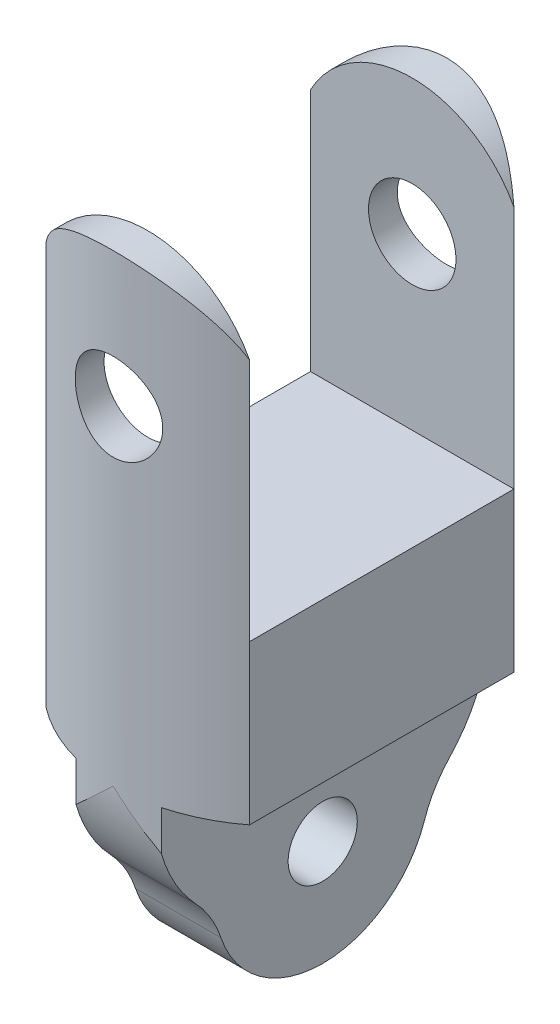
ISO-10303-21;
HEADER;
FILE_DESCRIPTION(('STEP AP214'),'2;1');
FILE_NAME('part.step','',(''),(''),'','','');
FILE_SCHEMA(('AUTOMOTIVE_DESIGN { 1 0 10303 214 1 1 1 1 }'));
ENDSEC;
DATA;
#1=APPLICATION_CONTEXT('core data for automotive mechanical design processes');
#2=APPLICATION_PROTOCOL_DEFINITION('international standard','automotive_design',2000,#1);
#3=PRODUCT_CONTEXT('',#1,'mechanical');
#4=PRODUCT('Part','Part','',(#3));
#5=PRODUCT_RELATED_PRODUCT_CATEGORY('part','',(#4));
#6=PRODUCT_DEFINITION_FORMATION('','',#4);
#7=PRODUCT_DEFINITION_CONTEXT('part definition',#1,'design');
#8=PRODUCT_DEFINITION('design','',#6,#7);
#9=PRODUCT_DEFINITION_SHAPE('','',#8);
#10=(LENGTH_UNIT() NAMED_UNIT(*) SI_UNIT(.MILLI.,.METRE.));
#11=(NAMED_UNIT(*) PLANE_ANGLE_UNIT() SI_UNIT($,.RADIAN.));
#12=(NAMED_UNIT(*) SI_UNIT($,.STERADIAN.) SOLID_ANGLE_UNIT());
#13=UNCERTAINTY_MEASURE_WITH_UNIT(LENGTH_MEASURE(1.E-05),#10,'distance_accuracy_value','');
#14=(GEOMETRIC_REPRESENTATION_CONTEXT(3) GLOBAL_UNCERTAINTY_ASSIGNED_CONTEXT((#13)) GLOBAL_UNIT_ASSIGNED_CONTEXT((#10,
#11,#12)) REPRESENTATION_CONTEXT('',''));
#15=CARTESIAN_POINT('',(0.,0.,0.));
#16=DIRECTION('',(0.,0.,1.));
#17=DIRECTION('',(1.,0.,0.));
#18=AXIS2_PLACEMENT_3D('',#15,#16,#17);
#19=CARTESIAN_POINT('',(1.05,0.,-0.499999999999999));
#20=DIRECTION('',(-1.,0.,0.));
#21=DIRECTION('',(0.,0.,1.));
#22=AXIS2_PLACEMENT_3D('',#19,#20,#21);
#23=CYLINDRICAL_SURFACE('',#22,3.6);
#24=CARTESIAN_POINT('',(1.05,-0.982735393101146,-3.96326885285366));
#25=CARTESIAN_POINT('',(0.964043175641878,-0.902481091641217,-3.98603422124339));
#26=CARTESIAN_POINT('',(0.877743048242477,-0.821831456548573,-4.00591264577449));
#27=CARTESIAN_POINT('',(0.704582146062499,-0.659897508889304,-4.03997120784259));
#28=CARTESIAN_POINT('',(0.617721265402065,-0.578613075815934,-4.05415023524226));
#29=CARTESIAN_POINT('',(0.357375549309111,-0.334873916517844,-4.08813062306567));
#30=CARTESIAN_POINT('',(0.18329676022133,-0.171756829119035,-4.09959296728294));
#31=CARTESIAN_POINT('',(0.00622980268695264,-0.00583759021220857,-4.09999644868644));
#32=CARTESIAN_POINT('',(0.00311487836894643,-0.00291877351620507,-4.09999999830493));
#33=CARTESIAN_POINT('',(0.,0.,-4.1));
#34=B_SPLINE_CURVE_WITH_KNOTS('',3,(#24,#25,#26,#27,#28,#29,#30,#31,#32,#33),.UNSPECIFIED.,.F.,
.F.,(4,2,2,2,4),(0.,0.359236470320328,0.718542879404652,1.43369480765825,1.44650106056099),.UNSPECIFIED.);
#35=CARTESIAN_POINT('',(1.05,-0.982735393101146,-3.96326885285366));
#36=VERTEX_POINT('',#35);
#37=CARTESIAN_POINT('',(0.,0.,-4.1));
#38=VERTEX_POINT('',#37);
#39=EDGE_CURVE('E148',#36,#38,#34,.T.);
#40=ORIENTED_EDGE('',*,*,#39,.F.);
#41=CARTESIAN_POINT('',(1.05,0.,-0.499999999999999));
#42=DIRECTION('',(1.,0.,0.));
#43=DIRECTION('',(0.,0.,-1.));
#44=AXIS2_PLACEMENT_3D('',#41,#42,#43);
#45=CIRCLE('',#44,3.6);
#46=CARTESIAN_POINT('',(1.05,-2.46949591686409,-3.11946366964529));
#47=VERTEX_POINT('',#46);
#48=EDGE_CURVE('E172',#47,#36,#45,.T.);
#49=ORIENTED_EDGE('',*,*,#48,.F.);
#50=DIRECTION('',(-1.,0.,0.));
#51=VECTOR('',#50,1.);
#52=CARTESIAN_POINT('',(1.05,-2.46949591686409,-3.11946366964529));
#53=LINE('',#52,#51);
#54=CARTESIAN_POINT('',(-1.05,-2.46949591686409,-3.11946366964529));
#55=VERTEX_POINT('',#54);
#56=EDGE_CURVE('E238',#47,#55,#53,.T.);
#57=ORIENTED_EDGE('',*,*,#56,.T.);
#58=CARTESIAN_POINT('',(-1.05,0.,-0.499999999999999));
#59=DIRECTION('',(1.,0.,0.));
#60=DIRECTION('',(0.,0.,-1.));
#61=AXIS2_PLACEMENT_3D('',#58,#59,#60);
#62=CIRCLE('',#61,3.6);
#63=CARTESIAN_POINT('',(-1.05,-0.982735393101146,-3.96326885285366));
#64=VERTEX_POINT('',#63);
#65=EDGE_CURVE('E153',#55,#64,#62,.T.);
#66=ORIENTED_EDGE('',*,*,#65,.T.);
#67=CARTESIAN_POINT('',(-1.05,-0.982735393101146,-3.96326885285366));
#68=CARTESIAN_POINT('',(-0.964043175641878,-0.902481091641217,-3.98603422124339));
#69=CARTESIAN_POINT('',(-0.877743048242477,-0.821831456548573,-4.00591264577449));
#70=CARTESIAN_POINT('',(-0.704582146062499,-0.659897508889304,-4.03997120784259));
#71=CARTESIAN_POINT('',(-0.617721265402065,-0.578613075815934,-4.05415023524226));
#72=CARTESIAN_POINT('',(-0.357375549309111,-0.334873916517844,-4.08813062306567));
#73=CARTESIAN_POINT('',(-0.18329676022133,-0.171756829119035,-4.09959296728294));
#74=CARTESIAN_POINT('',(-0.00622980268695264,-0.00583759021220857,-4.09999644868644));
#75=CARTESIAN_POINT('',(-0.00311487836894643,-0.00291877351620507,-4.09999999830493));
#76=CARTESIAN_POINT('',(0.,0.,-4.1));
#77=B_SPLINE_CURVE_WITH_KNOTS('',3,(#67,#68,#69,#70,#71,#72,#73,#74,#75,#76),.UNSPECIFIED.,.F.,
.F.,(4,2,2,2,4),(0.,0.359236470320328,0.718542879404652,1.43369480765825,1.44650106056099),.UNSPECIFIED.);
#78=EDGE_CURVE('E59',#64,#38,#77,.T.);
#79=ORIENTED_EDGE('',*,*,#78,.T.);
#80=EDGE_LOOP('',(#40,#49,#57,#66,#79));
#81=FACE_BOUND('',#80,.T.);
#82=ADVANCED_FACE('F36',(#81),#23,.T.);
#83=CARTESIAN_POINT('',(1.05,0.,0.499999999999999));
#84=DIRECTION('',(-1.,0.,0.));
#85=DIRECTION('',(0.,0.,1.));
#86=AXIS2_PLACEMENT_3D('',#83,#84,#85);
#87=CYLINDRICAL_SURFACE('',#86,3.6);
#88=CARTESIAN_POINT('',(1.05,-0.982735393101146,3.96326885285366));
#89=CARTESIAN_POINT('',(0.964043175641878,-0.902481091641217,3.98603422124339));
#90=CARTESIAN_POINT('',(0.877743048242477,-0.821831456548573,4.00591264577449));
#91=CARTESIAN_POINT('',(0.704582146062499,-0.659897508889304,4.03997120784259));
#92=CARTESIAN_POINT('',(0.617721265402065,-0.578613075815934,4.05415023524226));
#93=CARTESIAN_POINT('',(0.357375549309111,-0.334873916517844,4.08813062306567));
#94=CARTESIAN_POINT('',(0.18329676022133,-0.171756829119035,4.09959296728294));
#95=CARTESIAN_POINT('',(0.00622980268695264,-0.00583759021220857,4.09999644868644));
#96=CARTESIAN_POINT('',(0.00311487836894643,-0.00291877351620507,4.09999999830493));
#97=CARTESIAN_POINT('',(0.,0.,4.1));
#98=B_SPLINE_CURVE_WITH_KNOTS('',3,(#88,#89,#90,#91,#92,#93,#94,#95,#96,#97),.UNSPECIFIED.,.F.,
.F.,(4,2,2,2,4),(0.,0.359236470320328,0.718542879404652,1.43369480765825,1.44650106056099),.UNSPECIFIED.);
#99=CARTESIAN_POINT('',(0.,0.,4.1));
#100=VERTEX_POINT('',#99);
#101=CARTESIAN_POINT('',(1.05,-0.982735393101146,3.96326885285366));
#102=VERTEX_POINT('',#101);
#103=EDGE_CURVE('E52',#100,#102,#98,.F.);
#104=ORIENTED_EDGE('',*,*,#103,.F.);
#105=CARTESIAN_POINT('',(-1.05,-0.982735393101146,3.96326885285366));
#106=CARTESIAN_POINT('',(-0.964043175641878,-0.902481091641217,3.98603422124339));
#107=CARTESIAN_POINT('',(-0.877743048242477,-0.821831456548573,4.00591264577449));
#108=CARTESIAN_POINT('',(-0.704582146062499,-0.659897508889304,4.03997120784259));
#109=CARTESIAN_POINT('',(-0.617721265402065,-0.578613075815934,4.05415023524226));
#110=CARTESIAN_POINT('',(-0.357375549309111,-0.334873916517844,4.08813062306567));
#111=CARTESIAN_POINT('',(-0.18329676022133,-0.171756829119035,4.09959296728294));
#112=CARTESIAN_POINT('',(-0.00622980268695264,-0.00583759021220857,4.09999644868644));
#113=CARTESIAN_POINT('',(-0.00311487836894643,-0.00291877351620507,4.09999999830493));
#114=CARTESIAN_POINT('',(0.,0.,4.1));
#115=B_SPLINE_CURVE_WITH_KNOTS('',3,(#105,#106,#107,#108,#109,#110,#111,#112,#113,#114),
.UNSPECIFIED.,.F.,.F.,(4,2,2,2,4),(0.,0.359236470320328,0.718542879404652,1.43369480765825,
1.44650106056099),.UNSPECIFIED.);
#116=CARTESIAN_POINT('',(-1.05,-0.982735393101146,3.96326885285366));
#117=VERTEX_POINT('',#116);
#118=EDGE_CURVE('E144',#100,#117,#115,.F.);
#119=ORIENTED_EDGE('',*,*,#118,.T.);
#120=CARTESIAN_POINT('',(-1.05,0.,0.499999999999999));
#121=DIRECTION('',(1.,0.,0.));
#122=DIRECTION('',(0.,0.,1.));
#123=AXIS2_PLACEMENT_3D('',#120,#121,#122);
#124=CIRCLE('',#123,3.6);
#125=CARTESIAN_POINT('',(-1.05,-2.46949591686409,3.11946366964529));
#126=VERTEX_POINT('',#125);
#127=EDGE_CURVE('E156',#117,#126,#124,.T.);
#128=ORIENTED_EDGE('',*,*,#127,.T.);
#129=DIRECTION('',(-1.,0.,0.));
#130=VECTOR('',#129,1.);
#131=CARTESIAN_POINT('',(1.05,-2.46949591686409,3.11946366964529));
#132=LINE('',#131,#130);
#133=CARTESIAN_POINT('',(1.05,-2.46949591686409,3.11946366964529));
#134=VERTEX_POINT('',#133);
#135=EDGE_CURVE('E245',#134,#126,#132,.T.);
#136=ORIENTED_EDGE('',*,*,#135,.F.);
#137=CARTESIAN_POINT('',(1.05,0.,0.499999999999999));
#138=DIRECTION('',(1.,0.,0.));
#139=DIRECTION('',(0.,0.,1.));
#140=AXIS2_PLACEMENT_3D('',#137,#138,#139);
#141=CIRCLE('',#140,3.6);
#142=EDGE_CURVE('E147',#102,#134,#141,.T.);
#143=ORIENTED_EDGE('',*,*,#142,.F.);
#144=EDGE_LOOP('',(#104,#119,#128,#136,#143));
#145=FACE_BOUND('',#144,.T.);
#146=ADVANCED_FACE('F143',(#145),#87,.T.);
#147=CARTESIAN_POINT('',(1.05,0.,-0.499999999999999));
#148=DIRECTION('',(1.,0.,0.));
#149=DIRECTION('',(0.,0.,-1.));
#150=AXIS2_PLACEMENT_3D('',#147,#148,#149);
#151=PLANE('',#150);
#152=CARTESIAN_POINT('',(1.05,-2.7,0.));
#153=DIRECTION('',(1.,0.,0.));
#154=DIRECTION('',(0.,0.,-1.));
#155=AXIS2_PLACEMENT_3D('',#152,#153,#154);
#156=CIRCLE('',#155,0.85);
#157=CARTESIAN_POINT('',(1.05,-2.7,-0.850000000000001));
#158=VERTEX_POINT('',#157);
#159=EDGE_CURVE('E577',#158,#158,#156,.T.);
#160=ORIENTED_EDGE('',*,*,#159,.F.);
#161=EDGE_LOOP('',(#160));
#162=FACE_BOUND('',#161,.T.);
#163=DIRECTION('',(0.,0.,1.));
#164=VECTOR('',#163,1.);
#165=CARTESIAN_POINT('',(1.05,0.,-4.1));
#166=LINE('',#165,#164);
#167=CARTESIAN_POINT('',(1.05,0.,-3.96326885285366));
#168=VERTEX_POINT('',#167);
#169=CARTESIAN_POINT('',(1.05,0.,3.96326885285366));
#170=VERTEX_POINT('',#169);
#171=EDGE_CURVE('E348',#168,#170,#166,.T.);
#172=ORIENTED_EDGE('',*,*,#171,.T.);
#173=DIRECTION('',(0.,1.,0.));
#174=VECTOR('',#173,1.);
#175=CARTESIAN_POINT('',(1.05,-5.3,3.96326885285366));
#176=LINE('',#175,#174);
#177=EDGE_CURVE('E11',#170,#102,#176,.F.);
#178=ORIENTED_EDGE('',*,*,#177,.T.);
#179=ORIENTED_EDGE('',*,*,#142,.T.);
#180=CARTESIAN_POINT('',(1.05,-4.39021496331394,5.15682430159163));
#181=DIRECTION('',(-1.,0.,0.));
#182=DIRECTION('',(0.,0.,-1.));
#183=AXIS2_PLACEMENT_3D('',#180,#181,#182);
#184=CIRCLE('',#183,2.8);
#185=CARTESIAN_POINT('',(1.05,-3.5,2.50210824914987));
#186=VERTEX_POINT('',#185);
#187=EDGE_CURVE('E227',#134,#186,#184,.T.);
#188=ORIENTED_EDGE('',*,*,#187,.T.);
#189=CARTESIAN_POINT('',(1.05,-2.66095953042672,0.));
#190=DIRECTION('',(1.,0.,0.));
#191=DIRECTION('',(0.,0.,1.));
#192=AXIS2_PLACEMENT_3D('',#189,#190,#191);
#193=CIRCLE('',#192,2.63904046957328);
#194=CARTESIAN_POINT('',(1.05,-3.5,-2.50210824914987));
#195=VERTEX_POINT('',#194);
#196=EDGE_CURVE('E374',#186,#195,#193,.T.);
#197=ORIENTED_EDGE('',*,*,#196,.T.);
#198=CARTESIAN_POINT('',(1.05,-4.39021496331394,-5.15682430159163));
#199=DIRECTION('',(-1.,0.,0.));
#200=DIRECTION('',(0.,0.,1.));
#201=AXIS2_PLACEMENT_3D('',#198,#199,#200);
#202=CIRCLE('',#201,2.8);
#203=EDGE_CURVE('E224',#195,#47,#202,.T.);
#204=ORIENTED_EDGE('',*,*,#203,.T.);
#205=ORIENTED_EDGE('',*,*,#48,.T.);
#206=DIRECTION('',(0.,1.,0.));
#207=VECTOR('',#206,1.);
#208=CARTESIAN_POINT('',(1.05,-5.3,-3.96326885285366));
#209=LINE('',#208,#207);
#210=EDGE_CURVE('E45',#36,#168,#209,.T.);
#211=ORIENTED_EDGE('',*,*,#210,.T.);
#212=EDGE_LOOP('',(#172,#178,#179,#188,#197,#204,#205,#211));
#213=FACE_BOUND('',#212,.T.);
#214=ADVANCED_FACE('F179',(#162,#213),#151,.T.);
#215=CARTESIAN_POINT('',(0.,0.,0.));
#216=DIRECTION('',(0.,1.,0.));
#217=DIRECTION('',(0.,0.,1.));
#218=AXIS2_PLACEMENT_3D('',#215,#216,#217);
#219=PLANE('',#218);
#220=ORIENTED_EDGE('',*,*,#171,.F.);
#221=CARTESIAN_POINT('',(0.,0.,0.));
#222=DIRECTION('',(0.,1.,0.));
#223=DIRECTION('',(0.,0.,1.));
#224=AXIS2_PLACEMENT_3D('',#221,#222,#223);
#225=CIRCLE('',#224,4.1);
#226=CARTESIAN_POINT('',(2.5,0.,-3.24961536185438));
#227=VERTEX_POINT('',#226);
#228=EDGE_CURVE('E334',#227,#168,#225,.T.);
#229=ORIENTED_EDGE('',*,*,#228,.F.);
#230=DIRECTION('',(0.,0.,1.));
#231=VECTOR('',#230,1.);
#232=CARTESIAN_POINT('',(2.5,0.,-3.24961536185438));
#233=LINE('',#232,#231);
#234=CARTESIAN_POINT('',(2.5,0.,3.24961536185438));
#235=VERTEX_POINT('',#234);
#236=EDGE_CURVE('E321',#227,#235,#233,.T.);
#237=ORIENTED_EDGE('',*,*,#236,.T.);
#238=EDGE_CURVE('E318',#170,#235,#225,.T.);
#239=ORIENTED_EDGE('',*,*,#238,.F.);
#240=EDGE_LOOP('',(#220,#229,#237,#239));
#241=FACE_BOUND('',#240,.T.);
#242=ADVANCED_FACE('F387',(#241),#219,.F.);
#243=CARTESIAN_POINT('',(0.,3.9,0.));
#244=DIRECTION('',(0.,-1.,0.));
#245=DIRECTION('',(0.,0.,-1.));
#246=AXIS2_PLACEMENT_3D('',#243,#244,#245);
#247=CYLINDRICAL_SURFACE('',#246,4.1);
#248=CARTESIAN_POINT('',(1.075,8.075,3.95656100673299));
#249=CARTESIAN_POINT('',(1.07499849759736,8.01574132662267,3.95656206740196));
#250=CARTESIAN_POINT('',(1.07008341377569,7.9564665605543,3.95790686017436));
#251=CARTESIAN_POINT('',(1.05058857711479,7.83962623334418,3.96312528869724));
#252=CARTESIAN_POINT('',(1.0360037644684,7.78206158352731,3.96700024837327));
#253=CARTESIAN_POINT('',(0.997679687998758,7.67034855045897,3.97681065220181));
#254=CARTESIAN_POINT('',(0.973953005652445,7.61619559053382,3.98274326340092));
#255=CARTESIAN_POINT('',(0.918057826828671,7.51263105984774,3.99599692599379));
#256=CARTESIAN_POINT('',(0.885888755045638,7.46321981252372,4.00331807199965));
#257=CARTESIAN_POINT('',(0.813190218566315,7.36934621413438,4.01872226266153));
#258=CARTESIAN_POINT('',(0.772493510240412,7.32501551218003,4.02681845490151));
#259=CARTESIAN_POINT('',(0.68425476628872,7.24372408582354,4.04274686541313));
#260=CARTESIAN_POINT('',(0.636712041411825,7.20676410439388,4.05057905700731));
#261=CARTESIAN_POINT('',(0.535220965322456,7.14071714264202,4.06524336070602));
#262=CARTESIAN_POINT('',(0.481184998356998,7.11176061786676,4.07205815267456));
#263=CARTESIAN_POINT('',(0.368803395967924,7.06339262097833,4.08376919542231));
#264=CARTESIAN_POINT('',(0.310458463981335,7.04397959483679,4.08866575853249));
#265=CARTESIAN_POINT('',(0.192488821876719,7.0156745293719,4.09589567340773));
#266=CARTESIAN_POINT('',(0.132921214497386,7.00655864905926,4.0982834770156));
#267=CARTESIAN_POINT('',(0.0130575266366287,6.99840284137139,4.10041704245248));
#268=CARTESIAN_POINT('',(-0.0472384342389824,6.99936128152852,4.10016323233513));
#269=CARTESIAN_POINT('',(-0.165290750598638,7.01116835633689,4.09708223923197));
#270=CARTESIAN_POINT('',(-0.223073179232972,7.02177521284475,4.09431796819109));
#271=CARTESIAN_POINT('',(-0.336007436455476,7.05218797022689,4.08660061506));
#272=CARTESIAN_POINT('',(-0.391159117426172,7.07199438664224,4.08164741030325));
#273=CARTESIAN_POINT('',(-0.497888950041009,7.12043214985336,4.07001462008528));
#274=CARTESIAN_POINT('',(-0.549427262375742,7.14914721098965,4.06331875939417));
#275=CARTESIAN_POINT('',(-0.647036803273639,7.21452310495379,4.04892345478641));
#276=CARTESIAN_POINT('',(-0.69310699455549,7.25118544163276,4.04122382103734));
#277=CARTESIAN_POINT('',(-0.779915378155389,7.3327021445523,4.02538680070955));
#278=CARTESIAN_POINT('',(-0.820454532592611,7.3777675039994,4.01724320473778));
#279=CARTESIAN_POINT('',(-0.89344741282204,7.47414154328828,4.0016432592795));
#280=CARTESIAN_POINT('',(-0.925900678865949,7.52545057788685,3.99418694888594));
#281=CARTESIAN_POINT('',(-0.981945388091943,7.63327574893972,3.98078160641959));
#282=CARTESIAN_POINT('',(-1.00548443968057,7.68982031126482,3.97484155036279));
#283=CARTESIAN_POINT('',(-1.04265792509342,7.80625855083137,3.9652537175281));
#284=CARTESIAN_POINT('',(-1.05629472163037,7.86615142547817,3.96160539396286));
#285=CARTESIAN_POINT('',(-1.07293702135626,7.98572896752369,3.95713012463314));
#286=CARTESIAN_POINT('',(-1.07623871357283,8.04536951842825,3.95622459952246));
#287=CARTESIAN_POINT('',(-1.07293171991393,8.16435022682968,3.95712276213092));
#288=CARTESIAN_POINT('',(-1.06632404911008,8.22369041446972,3.95892617235865));
#289=CARTESIAN_POINT('',(-1.04364663303936,8.33925615395164,3.96496326936691));
#290=CARTESIAN_POINT('',(-1.02775339250444,8.39551894073246,3.96915158592993));
#291=CARTESIAN_POINT('',(-0.987153686556943,8.50458069467325,3.97944259583222));
#292=CARTESIAN_POINT('',(-0.962446098844254,8.55737921972686,3.98554553294151));
#293=CARTESIAN_POINT('',(-0.904312656440511,8.65925721876358,3.99914056013659));
#294=CARTESIAN_POINT('',(-0.87071200611369,8.70823328433531,4.00665951542921));
#295=CARTESIAN_POINT('',(-0.79596409344592,8.7999606560087,4.02217544231572));
#296=CARTESIAN_POINT('',(-0.754815461445512,8.84271082982798,4.03017250048851));
#297=CARTESIAN_POINT('',(-0.664772555293326,8.9219942573166,4.0460129363827));
#298=CARTESIAN_POINT('',(-0.615694607454198,8.95832141136516,4.05384584531087));
#299=CARTESIAN_POINT('',(-0.511964720549799,9.02222070507396,4.06824652310823));
#300=CARTESIAN_POINT('',(-0.457313077652485,9.04979330960247,4.07481435914575));
#301=CARTESIAN_POINT('',(-0.344370986261521,9.09515102214198,4.08590269845685));
#302=CARTESIAN_POINT('',(-0.286111206476481,9.11300862287461,4.0904383198074));
#303=CARTESIAN_POINT('',(-0.167281547788191,9.13864192161308,4.0970176350422));
#304=CARTESIAN_POINT('',(-0.10671216540344,9.14641977412459,4.09906186144654));
#305=CARTESIAN_POINT('',(0.0130889998748183,9.15154156404195,4.10040384380439));
#306=CARTESIAN_POINT('',(0.0723071305459086,9.14918831288753,4.09978131012199));
#307=CARTESIAN_POINT('',(0.189473449554427,9.13481518474304,4.09603902270504));
#308=CARTESIAN_POINT('',(0.247421682699277,9.12279564938683,4.09291935722621));
#309=CARTESIAN_POINT('',(0.360051931358176,9.08960003028369,4.08454821532234));
#310=CARTESIAN_POINT('',(0.414752619289789,9.06848356586698,4.07931063275472));
#311=CARTESIAN_POINT('',(0.519865777088888,9.01774690943509,4.06725235139821));
#312=CARTESIAN_POINT('',(0.570277660162292,8.98812555619921,4.06043143645236));
#313=CARTESIAN_POINT('',(0.666799207184693,8.92032350606972,4.04571700275515));
#314=CARTESIAN_POINT('',(0.712763378381483,8.88194074009416,4.03780025326694));
#315=CARTESIAN_POINT('',(0.797700937302811,8.79809113914353,4.02188321156095));
#316=CARTESIAN_POINT('',(0.836672501808807,8.75262246237989,4.01388289812884));
#317=CARTESIAN_POINT('',(0.907329372554603,8.65473947215321,3.99851113661077));
#318=CARTESIAN_POINT('',(0.938843946119757,8.60219905042554,3.99115648067752));
#319=CARTESIAN_POINT('',(0.992547135869787,8.49237942406629,3.97814264152138));
#320=CARTESIAN_POINT('',(1.01474204286978,8.43510344731207,3.97248231536201));
#321=CARTESIAN_POINT('',(1.04616012719663,8.32750603338091,3.96431125525536));
#322=CARTESIAN_POINT('',(1.05695019622802,8.27766486008334,3.96142796740732));
#323=CARTESIAN_POINT('',(1.07137040067468,8.17688634565879,3.95755248696796));
#324=CARTESIAN_POINT('',(1.0750012917281,8.12594912079182,3.95656009479642));
#325=CARTESIAN_POINT('',(1.075,8.075,3.95656100673299));
#326=B_SPLINE_CURVE_WITH_KNOTS('',3,(#248,#249,#250,#251,#252,#253,#254,#255,#256,#257,#258,
#259,#260,#261,#262,#263,#264,#265,#266,#267,#268,#269,#270,#271,#272,#273,#274,#275,#276,#277,
#278,#279,#280,#281,#282,#283,#284,#285,#286,#287,#288,#289,#290,#291,#292,#293,#294,#295,#296,
#297,#298,#299,#300,#301,#302,#303,#304,#305,#306,#307,#308,#309,#310,#311,#312,#313,#314,#315,
#316,#317,#318,#319,#320,#321,#322,#323,#324,#325),.UNSPECIFIED.,.T.,.F.,(4,2,2,2,2,2,2,2,2,2,2,
2,2,2,2,2,2,2,2,2,2,2,2,2,2,2,2,2,2,2,2,2,2,2,2,2,2,2,4),(0.,0.177588741371418,
0.355270481701683,0.532708556397241,0.710158725729295,0.891484325944135,1.07282819464619,
1.25697373036639,1.44108927056122,1.62112044598208,1.80112244915908,1.97673445435677,
2.15235630199548,2.32968118431429,2.50703965089424,2.68966653121833,2.87230379299251,
3.05599839941213,3.23964916124055,3.41798617958531,3.59630493111664,3.77133957742091,
3.94639651823583,4.12518916377867,4.30401428525191,4.48781553451443,4.67160702226225,
4.8540075729213,5.03636912976197,5.21331848145064,5.39026157952297,5.56606226302006,
5.74188696100501,5.9222718363669,6.10270367628155,6.28693539593015,6.47104255768414,
6.62374502080807,6.77643136560332),.UNSPECIFIED.);
#327=CARTESIAN_POINT('',(1.075,8.075,3.95656100673299));
#328=VERTEX_POINT('',#327);
#329=EDGE_CURVE('E286',#328,#328,#326,.T.);
#330=ORIENTED_EDGE('',*,*,#329,.T.);
#331=EDGE_LOOP('',(#330));
#332=FACE_BOUND('',#331,.T.);
#333=DIRECTION('',(0.,-1.,0.));
#334=VECTOR('',#333,1.);
#335=CARTESIAN_POINT('',(2.5,11.4,3.24961536185438));
#336=LINE('',#335,#334);
#337=CARTESIAN_POINT('',(2.5,9.9,3.24961536185438));
#338=VERTEX_POINT('',#337);
#339=CARTESIAN_POINT('',(2.5,3.9,3.24961536185438));
#340=VERTEX_POINT('',#339);
#341=EDGE_CURVE('E304',#338,#340,#336,.T.);
#342=ORIENTED_EDGE('',*,*,#341,.F.);
#343=CARTESIAN_POINT('',(2.5,9.9,3.24961536185439));
#344=CARTESIAN_POINT('',(2.46013548099443,9.97471208569658,3.28029390314277));
#345=CARTESIAN_POINT('',(2.41717036515848,10.0472365672999,3.31217101360941));
#346=CARTESIAN_POINT('',(2.32528605597071,10.1877444248687,3.37730632752105));
#347=CARTESIAN_POINT('',(2.27636749649934,10.2557282830959,3.41056438368476));
#348=CARTESIAN_POINT('',(2.17244834622658,10.3874695633957,3.47768922667194));
#349=CARTESIAN_POINT('',(2.11740715624514,10.4511936636519,3.5115586559591));
#350=CARTESIAN_POINT('',(2.00175160233029,10.5736229646301,3.57875382849721));
#351=CARTESIAN_POINT('',(1.94113702293288,10.6323279711474,3.61207955067005));
#352=CARTESIAN_POINT('',(1.750932692741,10.8006391652703,3.71005242849006));
#353=CARTESIAN_POINT('',(1.61300542292624,10.9024121637702,3.77267969680745));
#354=CARTESIAN_POINT('',(1.39172276434013,11.0361425048406,3.8573788660353));
#355=CARTESIAN_POINT('',(1.31563554445646,11.0775366733099,3.88405247160642));
#356=CARTESIAN_POINT('',(1.15899557793791,11.1535718536079,3.93363265996624));
#357=CARTESIAN_POINT('',(1.07844456040896,11.1882154571865,3.95654068794575));
#358=CARTESIAN_POINT('',(0.87161703616682,11.2658649505352,4.00832558415216));
#359=CARTESIAN_POINT('',(0.742829558698665,11.3042305315912,4.03435636380603));
#360=CARTESIAN_POINT('',(0.479494894856226,11.3623689625353,4.07402962501726));
#361=CARTESIAN_POINT('',(0.344963684696123,11.3821902669618,4.08770438852032));
#362=CARTESIAN_POINT('',(0.174720015743885,11.3948253351228,4.09642577360424));
#363=CARTESIAN_POINT('',(0.139824069863974,11.3967640702565,4.09776444928298));
#364=CARTESIAN_POINT('',(0.0699538548544662,11.3993516474626,4.09955177138463));
#365=CARTESIAN_POINT('',(0.0349795773332073,11.4000003439956,4.10000031738499));
#366=CARTESIAN_POINT('',(-0.0705326275234898,11.3999993063692,4.09999936002666));
#367=CARTESIAN_POINT('',(-0.141086803270432,11.3973597133826,4.09817371029439));
#368=CARTESIAN_POINT('',(-0.281631663837934,11.386851447804,4.09092325567739));
#369=CARTESIAN_POINT('',(-0.351621973067867,11.3789795413815,4.08549622496292));
#370=CARTESIAN_POINT('',(-0.560160092293412,11.3476229946686,4.06394972404165));
#371=CARTESIAN_POINT('',(-0.697105945005013,11.3163978805929,4.04256525723419));
#372=CARTESIAN_POINT('',(-0.961763923662677,11.2353542050529,3.98788619420598));
#373=CARTESIAN_POINT('',(-1.089525090142,11.1856447636035,3.95466154209714));
#374=CARTESIAN_POINT('',(-1.33432298317945,11.0698045026656,3.87891749431155));
#375=CARTESIAN_POINT('',(-1.45135865816381,11.0036720753493,3.83639718862925));
#376=CARTESIAN_POINT('',(-1.68302206816108,10.8505626948263,3.7409223700162));
#377=CARTESIAN_POINT('',(-1.79652340150007,10.7622602946363,3.68737788239186));
#378=CARTESIAN_POINT('',(-2.00798304502541,10.5706970466846,3.57662450607905));
#379=CARTESIAN_POINT('',(-2.10594319410838,10.467437971428,3.51941605205222));
#380=CARTESIAN_POINT('',(-2.25343980839838,10.28659211328,3.42588525157714));
#381=CARTESIAN_POINT('',(-2.30779177499314,10.2129711368809,3.38938549714887));
#382=CARTESIAN_POINT('',(-2.40931131382345,10.0604338063828,3.31799390065366));
#383=CARTESIAN_POINT('',(-2.45649183898819,9.98152737942221,3.28309924097795));
#384=CARTESIAN_POINT('',(-2.5,9.9,3.24961536185439));
#385=B_SPLINE_CURVE_WITH_KNOTS('',3,(#343,#344,#345,#346,#347,#348,#349,#350,#351,#352,#353,
#354,#355,#356,#357,#358,#359,#360,#361,#362,#363,#364,#365,#366,#367,#368,#369,#370,#371,#372,
#373,#374,#375,#376,#377,#378,#379,#380,#381,#382,#383,#384),.UNSPECIFIED.,.F.,.F.,(4,2,2,2,2,2,
2,2,2,2,2,2,2,2,2,2,2,2,2,2,4),(0.,0.270065395799829,0.540102062066677,0.812050112410337,
1.08400868053148,1.62804583983803,1.8995932654165,2.17103622926108,2.57984576063656,
2.98758410124906,3.09248976179476,3.19740725690469,3.40896231752748,3.62064825146093,
4.04452028947685,4.46592878019221,4.88737854352215,5.34606544104493,5.80469802430979,
6.09988022614947,6.39452277247205),.UNSPECIFIED.);
#386=CARTESIAN_POINT('',(-2.5,9.9,3.24961536185438));
#387=VERTEX_POINT('',#386);
#388=EDGE_CURVE('E269',#338,#387,#385,.T.);
#389=ORIENTED_EDGE('',*,*,#388,.T.);
#390=DIRECTION('',(0.,-1.,0.));
#391=VECTOR('',#390,1.);
#392=CARTESIAN_POINT('',(-2.5,11.4,3.24961536185438));
#393=LINE('',#392,#391);
#394=CARTESIAN_POINT('',(-2.5,3.9,3.24961536185438));
#395=VERTEX_POINT('',#394);
#396=EDGE_CURVE('E302',#387,#395,#393,.T.);
#397=ORIENTED_EDGE('',*,*,#396,.T.);
#398=DIRECTION('',(0.,1.,0.));
#399=VECTOR('',#398,1.);
#400=CARTESIAN_POINT('',(-2.5,0.,3.24961536185438));
#401=LINE('',#400,#399);
#402=CARTESIAN_POINT('',(-2.5,0.,3.24961536185438));
#403=VERTEX_POINT('',#402);
#404=EDGE_CURVE('E310',#403,#395,#401,.T.);
#405=ORIENTED_EDGE('',*,*,#404,.F.);
#406=CARTESIAN_POINT('',(-1.05,0.,3.96326885285366));
#407=VERTEX_POINT('',#406);
#408=EDGE_CURVE('E331',#403,#407,#225,.T.);
#409=ORIENTED_EDGE('',*,*,#408,.T.);
#410=DIRECTION('',(0.,1.,0.));
#411=VECTOR('',#410,1.);
#412=CARTESIAN_POINT('',(-1.05,-5.3,3.96326885285366));
#413=LINE('',#412,#411);
#414=EDGE_CURVE('E152',#117,#407,#413,.T.);
#415=ORIENTED_EDGE('',*,*,#414,.F.);
#416=ORIENTED_EDGE('',*,*,#118,.F.);
#417=ORIENTED_EDGE('',*,*,#103,.T.);
#418=ORIENTED_EDGE('',*,*,#177,.F.);
#419=ORIENTED_EDGE('',*,*,#238,.T.);
#420=DIRECTION('',(0.,1.,0.));
#421=VECTOR('',#420,1.);
#422=CARTESIAN_POINT('',(2.5,0.,3.24961536185438));
#423=LINE('',#422,#421);
#424=EDGE_CURVE('E314',#235,#340,#423,.T.);
#425=ORIENTED_EDGE('',*,*,#424,.T.);
#426=EDGE_LOOP('',(#342,#389,#397,#405,#409,#415,#416,#417,#418,#419,#425));
#427=FACE_BOUND('',#426,.T.);
#428=ADVANCED_FACE('F38',(#332,#427),#247,.T.);
#429=CARTESIAN_POINT('',(0.,7.,-4.10000000000018));
#430=CARTESIAN_POINT('',(0.059298187924991,7.00000148136351,-4.09999907221556));
#431=CARTESIAN_POINT('',(0.118612427011494,7.0049228957513,-4.09870085472821));
#432=CARTESIAN_POINT('',(0.235534618150951,7.02444515277093,-4.09364800727283));
#433=CARTESIAN_POINT('',(0.293141693853411,7.03905087978815,-4.0898921377746));
#434=CARTESIAN_POINT('',(0.404944739193113,7.07743606707615,-4.08033890742305));
#435=CARTESIAN_POINT('',(0.459144924220293,7.10120392028578,-4.07454413037169));
#436=CARTESIAN_POINT('',(0.562789548429997,7.15719624524175,-4.06152678464816));
#437=CARTESIAN_POINT('',(0.612233712683902,7.18942120546233,-4.05430413350933));
#438=CARTESIAN_POINT('',(0.706074235653362,7.26217791240352,-4.03903048009721));
#439=CARTESIAN_POINT('',(0.750348446588935,7.30286431401023,-4.03096569173524));
#440=CARTESIAN_POINT('',(0.831529684176905,7.39105822254325,-4.01500606940436));
#441=CARTESIAN_POINT('',(0.868435795426658,7.4385665757605,-4.00711125666156));
#442=CARTESIAN_POINT('',(0.934422975342834,7.54002350387163,-3.99224501029514));
#443=CARTESIAN_POINT('',(0.963364588430101,7.59406556698372,-3.98529100037371));
#444=CARTESIAN_POINT('',(1.01170338195221,7.70646017620907,-3.97329596697846));
#445=CARTESIAN_POINT('',(1.0311022574656,7.76481195466718,-3.9682546037972));
#446=CARTESIAN_POINT('',(1.0593827543449,7.8828194294272,-3.96079782549151));
#447=CARTESIAN_POINT('',(1.0684853392682,7.94241860794911,-3.95832733502279));
#448=CARTESIAN_POINT('',(1.07660358597314,8.06234536589773,-3.95612738548504));
#449=CARTESIAN_POINT('',(1.07562106493027,8.1226728121456,-3.95639743261468));
#450=CARTESIAN_POINT('',(1.06377265181095,8.24062757666142,-3.9595986950993));
#451=CARTESIAN_POINT('',(1.05317300625732,8.29828389272186,-3.96245821770936));
#452=CARTESIAN_POINT('',(1.02281718903794,8.41096981460954,-3.97040158919315));
#453=CARTESIAN_POINT('',(1.00306030728312,8.46599921637017,-3.97548561056178));
#454=CARTESIAN_POINT('',(0.954731181351757,8.57256868037033,-3.98736893336874));
#455=CARTESIAN_POINT('',(0.926064700040154,8.62406389259491,-3.99418642242614));
#456=CARTESIAN_POINT('',(0.860795897501806,8.72160713468464,-4.00875861080017));
#457=CARTESIAN_POINT('',(0.824192061246408,8.7676541220324,-4.01651348891404));
#458=CARTESIAN_POINT('',(0.742721378570034,8.85451626006213,-4.03238604386806));
#459=CARTESIAN_POINT('',(0.697630646669353,8.89512102585551,-4.04050745576043));
#460=CARTESIAN_POINT('',(0.60118107098123,8.96823478135332,-4.05597870320851));
#461=CARTESIAN_POINT('',(0.549821996252768,9.00074347264439,-4.06332851031785));
#462=CARTESIAN_POINT('',(0.441974865730776,9.05683065103601,-4.0764711802028));
#463=CARTESIAN_POINT('',(0.38546672594732,9.08037213697244,-4.0822575639407));
#464=CARTESIAN_POINT('',(0.269108758214193,9.11756119600507,-4.09157452011389));
#465=CARTESIAN_POINT('',(0.209259638293883,9.13121085689448,-4.09510556854719));
#466=CARTESIAN_POINT('',(0.0897149693949427,9.14790095072345,-4.0994424384577));
#467=CARTESIAN_POINT('',(0.0300619784454669,9.15122754455207,-4.1003217475873));
#468=CARTESIAN_POINT('',(-0.0889491967126424,9.14796586127824,-4.09946680430288));
#469=CARTESIAN_POINT('',(-0.148307409713506,9.14137857240846,-4.09773281238713));
#470=CARTESIAN_POINT('',(-0.264030106437415,9.11871116455697,-4.0918934669123));
#471=CARTESIAN_POINT('',(-0.32042785064287,9.10278969824592,-4.08782776981995));
#472=CARTESIAN_POINT('',(-0.429747226092217,9.06208929426647,-4.07778533363677));
#473=CARTESIAN_POINT('',(-0.482668486519307,9.03730941353133,-4.07180839108192));
#474=CARTESIAN_POINT('',(-0.584651886898053,8.97905830588664,-4.05843319621241));
#475=CARTESIAN_POINT('',(-0.633621031826837,8.94543014105881,-4.051009981465));
#476=CARTESIAN_POINT('',(-0.725321998312626,8.87063523620647,-4.03560079455014));
#477=CARTESIAN_POINT('',(-0.768052627600417,8.82946705855859,-4.02761471524256));
#478=CARTESIAN_POINT('',(-0.847262222637453,8.73942704465668,-4.01171108239886));
#479=CARTESIAN_POINT('',(-0.8835395880225,8.69037616416368,-4.00380129774157));
#480=CARTESIAN_POINT('',(-0.947351308097618,8.58671678966325,-3.98918553622595));
#481=CARTESIAN_POINT('',(-0.974886036221682,8.53210853316582,-3.98247950795556));
#482=CARTESIAN_POINT('',(-1.02022362214585,8.41916395064322,-3.97110694263566));
#483=CARTESIAN_POINT('',(-1.03808339426918,8.36085173268182,-3.96642851125498));
#484=CARTESIAN_POINT('',(-1.06370340841739,8.24190895138773,-3.95963559721858));
#485=CARTESIAN_POINT('',(-1.07146612739944,8.18127896039747,-3.95752048575109));
#486=CARTESIAN_POINT('',(-1.07653271671727,8.06148217150683,-3.95614497549777));
#487=CARTESIAN_POINT('',(-1.0741600993532,8.00232986134822,-3.95679627124633));
#488=CARTESIAN_POINT('',(-1.05977105362086,7.88530048648088,-3.96067414851925));
#489=CARTESIAN_POINT('',(-1.04775485796245,7.82742339103449,-3.96390066790071));
#490=CARTESIAN_POINT('',(-1.01460439949381,7.71497932735777,-3.9725137842733));
#491=CARTESIAN_POINT('',(-0.993536532066969,7.66039149394822,-3.97788463237877));
#492=CARTESIAN_POINT('',(-0.942932535095381,7.5554845569348,-3.99018210643225));
#493=CARTESIAN_POINT('',(-0.913395118144874,7.50516610380201,-3.99710896886603));
#494=CARTESIAN_POINT('',(-0.84570077989754,7.40867680205412,-4.01198476145907));
#495=CARTESIAN_POINT('',(-0.807322068238865,7.36266515906696,-4.01995720562078));
#496=CARTESIAN_POINT('',(-0.723459236275624,7.27763003598223,-4.03589213483678));
#497=CARTESIAN_POINT('',(-0.677973402725592,7.23860824574221,-4.0438546170219));
#498=CARTESIAN_POINT('',(-0.580063757413037,7.16787691696896,-4.05906728698994));
#499=CARTESIAN_POINT('',(-0.527516974313617,7.13633342949636,-4.06629955552483));
#500=CARTESIAN_POINT('',(-0.41767935925199,7.08257778516402,-4.07904291155516));
#501=CARTESIAN_POINT('',(-0.360391700162974,7.06035944686988,-4.08455513860422));
#502=CARTESIAN_POINT('',(-0.252737845255856,7.02889324447581,-4.09249631460973));
#503=CARTESIAN_POINT('',(-0.202849579269884,7.01808295640708,-4.09529001776243));
#504=CARTESIAN_POINT('',(-0.101978098435275,7.00363602666825,-4.09904217510548));
#505=CARTESIAN_POINT('',(-0.0509949845979913,6.99999872606378,-4.10000079787215));
#506=CARTESIAN_POINT('',(0.,7.,-4.10000000000018));
#507=B_SPLINE_CURVE_WITH_KNOTS('',3,(#429,#430,#431,#432,#433,#434,#435,#436,#437,#438,#439,
#440,#441,#442,#443,#444,#445,#446,#447,#448,#449,#450,#451,#452,#453,#454,#455,#456,#457,#458,
#459,#460,#461,#462,#463,#464,#465,#466,#467,#468,#469,#470,#471,#472,#473,#474,#475,#476,#477,
#478,#479,#480,#481,#482,#483,#484,#485,#486,#487,#488,#489,#490,#491,#492,#493,#494,#495,#496,
#497,#498,#499,#500,#501,#502,#503,#504,#505,#506),.UNSPECIFIED.,.T.,.F.,(4,2,2,2,2,2,2,2,2,2,2,
2,2,2,2,2,2,2,2,2,2,2,2,2,2,2,2,2,2,2,2,2,2,2,2,2,2,2,4),(0.,0.177707589065026,
0.355504875077043,0.533077654513239,0.710660692638139,0.891831082336794,1.07302396640949,
1.2572124369234,1.4413681781745,1.62149205948639,1.801583485913,1.97683638194784,
2.15210287007422,2.32929015327127,2.50651128659554,2.68931253007079,2.87212051042334,
3.0556748399294,3.23919041670954,3.41757121380216,3.59593423077172,3.77135007761953,
3.9467846048014,4.12556932335729,4.30438816561764,4.48806965615003,4.6717432998347,
4.85432438820507,5.03686067826887,5.21361482643785,5.39036470946813,5.56583966526995,
5.74134130812678,5.92184794274017,6.10239815767378,6.28664460679551,6.47076872940011,
6.62360693041472,6.7764310905523),.UNSPECIFIED.);
#508=CARTESIAN_POINT('',(0.,7.,-4.10000000000018));
#509=VERTEX_POINT('',#508);
#510=EDGE_CURVE('E280',#509,#509,#507,.T.);
#511=ORIENTED_EDGE('',*,*,#510,.T.);
#512=EDGE_LOOP('',(#511));
#513=FACE_BOUND('',#512,.T.);
#514=CARTESIAN_POINT('',(-2.5,9.9,-3.24961536185438));
#515=CARTESIAN_POINT('',(-2.46013548099443,9.97471208569658,-3.28029390314276));
#516=CARTESIAN_POINT('',(-2.41717036515848,10.0472365672999,-3.31217101360941));
#517=CARTESIAN_POINT('',(-2.32528605597071,10.1877444248687,-3.37730632752105));
#518=CARTESIAN_POINT('',(-2.27636749649934,10.2557282830959,-3.41056438368476));
#519=CARTESIAN_POINT('',(-2.17244834622658,10.3874695633957,-3.47768922667194));
#520=CARTESIAN_POINT('',(-2.11740715624515,10.4511936636519,-3.5115586559591));
#521=CARTESIAN_POINT('',(-2.00175160233029,10.5736229646301,-3.57875382849721));
#522=CARTESIAN_POINT('',(-1.94113702293288,10.6323279711474,-3.61207955067005));
#523=CARTESIAN_POINT('',(-1.750932692741,10.8006391652703,-3.71005242849006));
#524=CARTESIAN_POINT('',(-1.61300542292624,10.9024121637702,-3.77267969680745));
#525=CARTESIAN_POINT('',(-1.39172276434013,11.0361425048406,-3.8573788660353));
#526=CARTESIAN_POINT('',(-1.31563554445646,11.0775366733099,-3.88405247160642));
#527=CARTESIAN_POINT('',(-1.15899557793791,11.1535718536079,-3.93363265996624));
#528=CARTESIAN_POINT('',(-1.07844456040896,11.1882154571865,-3.95654068794575));
#529=CARTESIAN_POINT('',(-0.87161703616682,11.2658649505352,-4.00832558415215));
#530=CARTESIAN_POINT('',(-0.742829558698666,11.3042305315912,-4.03435636380603));
#531=CARTESIAN_POINT('',(-0.479494894856227,11.3623689625353,-4.07402962501726));
#532=CARTESIAN_POINT('',(-0.344963684696124,11.3821902669618,-4.08770438852032));
#533=CARTESIAN_POINT('',(-0.174720015743886,11.3948253351228,-4.09642577360424));
#534=CARTESIAN_POINT('',(-0.139824069863975,11.3967640702565,-4.09776444928298));
#535=CARTESIAN_POINT('',(-0.069953854854467,11.3993516474626,-4.09955177138463));
#536=CARTESIAN_POINT('',(-0.0349795773332082,11.4000003439956,-4.10000031738499));
#537=CARTESIAN_POINT('',(0.070532627523489,11.3999993063692,-4.09999936002666));
#538=CARTESIAN_POINT('',(0.141086803270431,11.3973597133826,-4.09817371029439));
#539=CARTESIAN_POINT('',(0.281631663837933,11.386851447804,-4.09092325567739));
#540=CARTESIAN_POINT('',(0.351621973067867,11.3789795413815,-4.08549622496292));
#541=CARTESIAN_POINT('',(0.560160092293411,11.3476229946686,-4.06394972404165));
#542=CARTESIAN_POINT('',(0.697105945005012,11.3163978805929,-4.04256525723419));
#543=CARTESIAN_POINT('',(0.961763923662676,11.2353542050529,-3.98788619420598));
#544=CARTESIAN_POINT('',(1.089525090142,11.1856447636035,-3.95466154209714));
#545=CARTESIAN_POINT('',(1.33432298317945,11.0698045026656,-3.87891749431155));
#546=CARTESIAN_POINT('',(1.45135865816381,11.0036720753493,-3.83639718862925));
#547=CARTESIAN_POINT('',(1.68302206816107,10.8505626948263,-3.7409223700162));
#548=CARTESIAN_POINT('',(1.79652340150007,10.7622602946363,-3.68737788239186));
#549=CARTESIAN_POINT('',(2.00798304502541,10.5706970466846,-3.57662450607905));
#550=CARTESIAN_POINT('',(2.10594319410838,10.467437971428,-3.51941605205222));
#551=CARTESIAN_POINT('',(2.25343980839838,10.28659211328,-3.42588525157714));
#552=CARTESIAN_POINT('',(2.30779177499314,10.2129711368809,-3.38938549714887));
#553=CARTESIAN_POINT('',(2.40931131382345,10.0604338063828,-3.31799390065366));
#554=CARTESIAN_POINT('',(2.45649183898819,9.98152737942221,-3.28309924097795));
#555=CARTESIAN_POINT('',(2.5,9.9,-3.24961536185439));
#556=B_SPLINE_CURVE_WITH_KNOTS('',3,(#514,#515,#516,#517,#518,#519,#520,#521,#522,#523,#524,
#525,#526,#527,#528,#529,#530,#531,#532,#533,#534,#535,#536,#537,#538,#539,#540,#541,#542,#543,
#544,#545,#546,#547,#548,#549,#550,#551,#552,#553,#554,#555),.UNSPECIFIED.,.F.,.F.,(4,2,2,2,2,2,
2,2,2,2,2,2,2,2,2,2,2,2,2,2,4),(0.,0.270065395799829,0.540102062066678,0.812050112410338,
1.08400868053148,1.62804583983803,1.8995932654165,2.17103622926108,2.57984576063656,
2.98758410124906,3.09248976179476,3.19740725690469,3.40896231752748,3.62064825146093,
4.04452028947685,4.46592878019221,4.88737854352215,5.34606544104493,5.80469802430979,
6.09988022614948,6.39452277247206),.UNSPECIFIED.);
#557=CARTESIAN_POINT('',(-2.5,9.9,-3.24961536185459));
#558=VERTEX_POINT('',#557);
#559=CARTESIAN_POINT('',(2.5,9.9,-3.24961536185459));
#560=VERTEX_POINT('',#559);
#561=EDGE_CURVE('E251',#558,#560,#556,.T.);
#562=ORIENTED_EDGE('',*,*,#561,.T.);
#563=DIRECTION('',(0.,-1.,0.));
#564=VECTOR('',#563,1.);
#565=CARTESIAN_POINT('',(2.5,11.4,-3.24961536185459));
#566=LINE('',#565,#564);
#567=CARTESIAN_POINT('',(2.5,3.9,-3.24961536185459));
#568=VERTEX_POINT('',#567);
#569=EDGE_CURVE('E295',#560,#568,#566,.T.);
#570=ORIENTED_EDGE('',*,*,#569,.T.);
#571=DIRECTION('',(0.,1.,0.));
#572=VECTOR('',#571,1.);
#573=CARTESIAN_POINT('',(2.5,0.,-3.24961536185438));
#574=LINE('',#573,#572);
#575=EDGE_CURVE('E324',#227,#568,#574,.T.);
#576=ORIENTED_EDGE('',*,*,#575,.F.);
#577=ORIENTED_EDGE('',*,*,#228,.T.);
#578=ORIENTED_EDGE('',*,*,#210,.F.);
#579=ORIENTED_EDGE('',*,*,#39,.T.);
#580=ORIENTED_EDGE('',*,*,#78,.F.);
#581=DIRECTION('',(0.,1.,0.));
#582=VECTOR('',#581,1.);
#583=CARTESIAN_POINT('',(-1.05,-5.3,-3.96326885285366));
#584=LINE('',#583,#582);
#585=CARTESIAN_POINT('',(-1.05,0.,-3.96326885285366));
#586=VERTEX_POINT('',#585);
#587=EDGE_CURVE('E337',#586,#64,#584,.F.);
#588=ORIENTED_EDGE('',*,*,#587,.F.);
#589=CARTESIAN_POINT('',(-2.5,0.,-3.24961536185438));
#590=VERTEX_POINT('',#589);
#591=EDGE_CURVE('E333',#586,#590,#225,.T.);
#592=ORIENTED_EDGE('',*,*,#591,.T.);
#593=DIRECTION('',(0.,1.,0.));
#594=VECTOR('',#593,1.);
#595=CARTESIAN_POINT('',(-2.5,0.,-3.24961536185438));
#596=LINE('',#595,#594);
#597=CARTESIAN_POINT('',(-2.5,3.9,-3.24961536185438));
#598=VERTEX_POINT('',#597);
#599=EDGE_CURVE('E315',#590,#598,#596,.T.);
#600=ORIENTED_EDGE('',*,*,#599,.T.);
#601=DIRECTION('',(0.,-1.,0.));
#602=VECTOR('',#601,1.);
#603=CARTESIAN_POINT('',(-2.5,11.4,-3.24961536185459));
#604=LINE('',#603,#602);
#605=EDGE_CURVE('E297',#558,#598,#604,.T.);
#606=ORIENTED_EDGE('',*,*,#605,.F.);
#607=EDGE_LOOP('',(#562,#570,#576,#577,#578,#579,#580,#588,#592,#600,#606));
#608=FACE_BOUND('',#607,.T.);
#609=ADVANCED_FACE('F370',(#513,#608),#247,.T.);
#610=CARTESIAN_POINT('',(-2.5,11.4,3.24961536185438));
#611=DIRECTION('',(0.,0.,1.));
#612=DIRECTION('',(1.,0.,0.));
#613=AXIS2_PLACEMENT_3D('',#610,#611,#612);
#614=PLANE('',#613);
#615=CARTESIAN_POINT('',(0.,8.075,3.24961536185438));
#616=DIRECTION('',(0.,0.,1.));
#617=DIRECTION('',(1.,0.,0.));
#618=AXIS2_PLACEMENT_3D('',#615,#616,#617);
#619=CIRCLE('',#618,1.075);
#620=CARTESIAN_POINT('',(1.075,8.075,3.24961536185438));
#621=VERTEX_POINT('',#620);
#622=EDGE_CURVE('E277',#621,#621,#619,.T.);
#623=ORIENTED_EDGE('',*,*,#622,.T.);
#624=EDGE_LOOP('',(#623));
#625=FACE_BOUND('',#624,.T.);
#626=CARTESIAN_POINT('',(0.,8.56666666666666,3.24961536185438));
#627=DIRECTION('',(0.,0.,1.));
#628=DIRECTION('',(1.,0.,0.));
#629=AXIS2_PLACEMENT_3D('',#626,#627,#628);
#630=CIRCLE('',#629,2.83333333333333);
#631=EDGE_CURVE('E257',#387,#338,#630,.F.);
#632=ORIENTED_EDGE('',*,*,#631,.T.);
#633=ORIENTED_EDGE('',*,*,#341,.T.);
#634=DIRECTION('',(-1.,0.,0.));
#635=VECTOR('',#634,1.);
#636=CARTESIAN_POINT('',(-2.5,3.9,3.24961536185438));
#637=LINE('',#636,#635);
#638=EDGE_CURVE('E299',#340,#395,#637,.T.);
#639=ORIENTED_EDGE('',*,*,#638,.T.);
#640=ORIENTED_EDGE('',*,*,#396,.F.);
#641=EDGE_LOOP('',(#632,#633,#639,#640));
#642=FACE_BOUND('',#641,.T.);
#643=ADVANCED_FACE('F358',(#625,#642),#614,.F.);
#644=CARTESIAN_POINT('',(-2.5,11.4,-3.24961536185459));
#645=DIRECTION('',(0.,0.,-1.));
#646=DIRECTION('',(-1.,0.,0.));
#647=AXIS2_PLACEMENT_3D('',#644,#645,#646);
#648=PLANE('',#647);
#649=CARTESIAN_POINT('',(0.,8.075,-3.24961536185459));
#650=DIRECTION('',(0.,0.,-1.));
#651=DIRECTION('',(-1.,0.,0.));
#652=AXIS2_PLACEMENT_3D('',#649,#650,#651);
#653=CIRCLE('',#652,1.075);
#654=CARTESIAN_POINT('',(-1.075,8.075,-3.24961536185459));
#655=VERTEX_POINT('',#654);
#656=EDGE_CURVE('E276',#655,#655,#653,.T.);
#657=ORIENTED_EDGE('',*,*,#656,.T.);
#658=EDGE_LOOP('',(#657));
#659=FACE_BOUND('',#658,.T.);
#660=ORIENTED_EDGE('',*,*,#569,.F.);
#661=CARTESIAN_POINT('',(0.,8.56666666666666,-3.24961536185459));
#662=DIRECTION('',(0.,0.,-1.));
#663=DIRECTION('',(-1.,0.,0.));
#664=AXIS2_PLACEMENT_3D('',#661,#662,#663);
#665=CIRCLE('',#664,2.83333333333333);
#666=EDGE_CURVE('E248',#560,#558,#665,.F.);
#667=ORIENTED_EDGE('',*,*,#666,.T.);
#668=ORIENTED_EDGE('',*,*,#605,.T.);
#669=DIRECTION('',(1.,0.,0.));
#670=VECTOR('',#669,1.);
#671=CARTESIAN_POINT('',(-2.5,3.9,-3.24961536185459));
#672=LINE('',#671,#670);
#673=EDGE_CURVE('E292',#598,#568,#672,.T.);
#674=ORIENTED_EDGE('',*,*,#673,.T.);
#675=EDGE_LOOP('',(#660,#667,#668,#674));
#676=FACE_BOUND('',#675,.T.);
#677=ADVANCED_FACE('F391',(#659,#676),#648,.F.);
#678=CARTESIAN_POINT('',(0.,3.9,0.));
#679=DIRECTION('',(0.,1.,0.));
#680=DIRECTION('',(0.,0.,1.));
#681=AXIS2_PLACEMENT_3D('',#678,#679,#680);
#682=PLANE('',#681);
#683=DIRECTION('',(0.,0.,1.));
#684=VECTOR('',#683,1.);
#685=CARTESIAN_POINT('',(2.5,3.9,-3.24961536185438));
#686=LINE('',#685,#684);
#687=EDGE_CURVE('E306',#568,#340,#686,.T.);
#688=ORIENTED_EDGE('',*,*,#687,.F.);
#689=ORIENTED_EDGE('',*,*,#673,.F.);
#690=DIRECTION('',(0.,0.,-1.));
#691=VECTOR('',#690,1.);
#692=CARTESIAN_POINT('',(-2.5,3.9,-3.24961536185438));
#693=LINE('',#692,#691);
#694=EDGE_CURVE('E311',#395,#598,#693,.T.);
#695=ORIENTED_EDGE('',*,*,#694,.F.);
#696=ORIENTED_EDGE('',*,*,#638,.F.);
#697=EDGE_LOOP('',(#688,#689,#695,#696));
#698=FACE_BOUND('',#697,.T.);
#699=ADVANCED_FACE('F361',(#698),#682,.T.);
#700=ORIENTED_EDGE('',*,*,#591,.F.);
#701=DIRECTION('',(0.,0.,1.));
#702=VECTOR('',#701,1.);
#703=CARTESIAN_POINT('',(-1.05,0.,-4.1));
#704=LINE('',#703,#702);
#705=EDGE_CURVE('E339',#586,#407,#704,.T.);
#706=ORIENTED_EDGE('',*,*,#705,.T.);
#707=ORIENTED_EDGE('',*,*,#408,.F.);
#708=DIRECTION('',(0.,0.,-1.));
#709=VECTOR('',#708,1.);
#710=CARTESIAN_POINT('',(-2.5,0.,-3.24961536185438));
#711=LINE('',#710,#709);
#712=EDGE_CURVE('E307',#403,#590,#711,.T.);
#713=ORIENTED_EDGE('',*,*,#712,.T.);
#714=EDGE_LOOP('',(#700,#706,#707,#713));
#715=FACE_BOUND('',#714,.T.);
#716=ADVANCED_FACE('F347',(#715),#219,.F.);
#717=CARTESIAN_POINT('',(2.5,0.,-3.24961536185438));
#718=DIRECTION('',(-1.,0.,0.));
#719=DIRECTION('',(0.,0.,1.));
#720=AXIS2_PLACEMENT_3D('',#717,#718,#719);
#721=PLANE('',#720);
#722=ORIENTED_EDGE('',*,*,#687,.T.);
#723=ORIENTED_EDGE('',*,*,#424,.F.);
#724=ORIENTED_EDGE('',*,*,#236,.F.);
#725=ORIENTED_EDGE('',*,*,#575,.T.);
#726=EDGE_LOOP('',(#722,#723,#724,#725));
#727=FACE_BOUND('',#726,.T.);
#728=ADVANCED_FACE('F365',(#727),#721,.F.);
#729=CARTESIAN_POINT('',(-2.5,0.,-3.24961536185438));
#730=DIRECTION('',(1.,0.,0.));
#731=DIRECTION('',(0.,0.,-1.));
#732=AXIS2_PLACEMENT_3D('',#729,#730,#731);
#733=PLANE('',#732);
#734=ORIENTED_EDGE('',*,*,#694,.T.);
#735=ORIENTED_EDGE('',*,*,#599,.F.);
#736=ORIENTED_EDGE('',*,*,#712,.F.);
#737=ORIENTED_EDGE('',*,*,#404,.T.);
#738=EDGE_LOOP('',(#734,#735,#736,#737));
#739=FACE_BOUND('',#738,.T.);
#740=ADVANCED_FACE('F354',(#739),#733,.F.);
#741=CARTESIAN_POINT('',(0.,8.075,-4.10000000000018));
#742=DIRECTION('',(0.,0.,1.));
#743=DIRECTION('',(1.,0.,0.));
#744=AXIS2_PLACEMENT_3D('',#741,#742,#743);
#745=CYLINDRICAL_SURFACE('',#744,1.075);
#746=ORIENTED_EDGE('',*,*,#656,.F.);
#747=EDGE_LOOP('',(#746));
#748=FACE_BOUND('',#747,.T.);
#749=ORIENTED_EDGE('',*,*,#510,.F.);
#750=EDGE_LOOP('',(#749));
#751=FACE_BOUND('',#750,.T.);
#752=ADVANCED_FACE('F397',(#748,#751),#745,.F.);
#753=ORIENTED_EDGE('',*,*,#622,.F.);
#754=EDGE_LOOP('',(#753));
#755=FACE_BOUND('',#754,.T.);
#756=ORIENTED_EDGE('',*,*,#329,.F.);
#757=EDGE_LOOP('',(#756));
#758=FACE_BOUND('',#757,.T.);
#759=ADVANCED_FACE('F265',(#755,#758),#745,.F.);
#760=CARTESIAN_POINT('',(0.,8.56666666666666,-4.10000000000018));
#761=DIRECTION('',(0.,0.,1.));
#762=DIRECTION('',(1.,0.,0.));
#763=AXIS2_PLACEMENT_3D('',#760,#761,#762);
#764=CYLINDRICAL_SURFACE('',#763,2.83333333333333);
#765=ORIENTED_EDGE('',*,*,#666,.F.);
#766=ORIENTED_EDGE('',*,*,#561,.F.);
#767=EDGE_LOOP('',(#765,#766));
#768=FACE_BOUND('',#767,.T.);
#769=ADVANCED_FACE('F263',(#768),#764,.T.);
#770=ORIENTED_EDGE('',*,*,#388,.F.);
#771=ORIENTED_EDGE('',*,*,#631,.F.);
#772=EDGE_LOOP('',(#770,#771));
#773=FACE_BOUND('',#772,.T.);
#774=ADVANCED_FACE('F259',(#773),#764,.T.);
#775=CARTESIAN_POINT('',(1.05,-4.39021496331394,5.15682430159163));
#776=DIRECTION('',(-1.,0.,0.));
#777=DIRECTION('',(0.,0.,1.));
#778=AXIS2_PLACEMENT_3D('',#775,#776,#777);
#779=CYLINDRICAL_SURFACE('',#778,2.8);
#780=CARTESIAN_POINT('',(-1.05,-4.39021496331394,5.15682430159163));
#781=DIRECTION('',(-1.,0.,0.));
#782=DIRECTION('',(0.,0.,-1.));
#783=AXIS2_PLACEMENT_3D('',#780,#781,#782);
#784=CIRCLE('',#783,2.8);
#785=CARTESIAN_POINT('',(-1.05,-3.5,2.50210824914987));
#786=VERTEX_POINT('',#785);
#787=EDGE_CURVE('E234',#126,#786,#784,.T.);
#788=ORIENTED_EDGE('',*,*,#787,.T.);
#789=DIRECTION('',(-1.,0.,0.));
#790=VECTOR('',#789,1.);
#791=CARTESIAN_POINT('',(1.05,-3.5,2.50210824914987));
#792=LINE('',#791,#790);
#793=EDGE_CURVE('E242',#186,#786,#792,.T.);
#794=ORIENTED_EDGE('',*,*,#793,.F.);
#795=ORIENTED_EDGE('',*,*,#187,.F.);
#796=ORIENTED_EDGE('',*,*,#135,.T.);
#797=EDGE_LOOP('',(#788,#794,#795,#796));
#798=FACE_BOUND('',#797,.T.);
#799=ADVANCED_FACE('F180',(#798),#779,.F.);
#800=CARTESIAN_POINT('',(1.05,-2.66095953042672,0.));
#801=DIRECTION('',(-1.,0.,0.));
#802=DIRECTION('',(0.,0.,1.));
#803=AXIS2_PLACEMENT_3D('',#800,#801,#802);
#804=CYLINDRICAL_SURFACE('',#803,2.63904046957328);
#805=CARTESIAN_POINT('',(-1.05,-2.66095953042672,0.));
#806=DIRECTION('',(1.,0.,0.));
#807=DIRECTION('',(0.,0.,1.));
#808=AXIS2_PLACEMENT_3D('',#805,#806,#807);
#809=CIRCLE('',#808,2.63904046957328);
#810=CARTESIAN_POINT('',(-1.05,-3.5,-2.50210824914987));
#811=VERTEX_POINT('',#810);
#812=EDGE_CURVE('E229',#786,#811,#809,.T.);
#813=ORIENTED_EDGE('',*,*,#812,.T.);
#814=DIRECTION('',(-1.,0.,0.));
#815=VECTOR('',#814,1.);
#816=CARTESIAN_POINT('',(1.05,-3.5,-2.50210824914987));
#817=LINE('',#816,#815);
#818=EDGE_CURVE('E240',#195,#811,#817,.T.);
#819=ORIENTED_EDGE('',*,*,#818,.F.);
#820=ORIENTED_EDGE('',*,*,#196,.F.);
#821=ORIENTED_EDGE('',*,*,#793,.T.);
#822=EDGE_LOOP('',(#813,#819,#820,#821));
#823=FACE_BOUND('',#822,.T.);
#824=ADVANCED_FACE('F385',(#823),#804,.T.);
#825=CARTESIAN_POINT('',(1.05,-4.39021496331394,-5.15682430159163));
#826=DIRECTION('',(-1.,0.,0.));
#827=DIRECTION('',(0.,0.,1.));
#828=AXIS2_PLACEMENT_3D('',#825,#826,#827);
#829=CYLINDRICAL_SURFACE('',#828,2.8);
#830=CARTESIAN_POINT('',(-1.05,-4.39021496331394,-5.15682430159163));
#831=DIRECTION('',(-1.,0.,0.));
#832=DIRECTION('',(0.,0.,1.));
#833=AXIS2_PLACEMENT_3D('',#830,#831,#832);
#834=CIRCLE('',#833,2.8);
#835=EDGE_CURVE('E226',#811,#55,#834,.T.);
#836=ORIENTED_EDGE('',*,*,#835,.T.);
#837=ORIENTED_EDGE('',*,*,#56,.F.);
#838=ORIENTED_EDGE('',*,*,#203,.F.);
#839=ORIENTED_EDGE('',*,*,#818,.T.);
#840=EDGE_LOOP('',(#836,#837,#838,#839));
#841=FACE_BOUND('',#840,.T.);
#842=ADVANCED_FACE('F206',(#841),#829,.F.);
#843=CARTESIAN_POINT('',(-1.05,0.,-0.499999999999999));
#844=DIRECTION('',(1.,0.,0.));
#845=DIRECTION('',(0.,0.,-1.));
#846=AXIS2_PLACEMENT_3D('',#843,#844,#845);
#847=PLANE('',#846);
#848=CARTESIAN_POINT('',(-1.05,-2.7,0.));
#849=DIRECTION('',(1.,0.,0.));
#850=DIRECTION('',(0.,0.,-1.));
#851=AXIS2_PLACEMENT_3D('',#848,#849,#850);
#852=CIRCLE('',#851,0.85);
#853=CARTESIAN_POINT('',(-1.05,-2.7,-0.850000000000001));
#854=VERTEX_POINT('',#853);
#855=EDGE_CURVE('E219',#854,#854,#852,.F.);
#856=ORIENTED_EDGE('',*,*,#855,.F.);
#857=EDGE_LOOP('',(#856));
#858=FACE_BOUND('',#857,.T.);
#859=ORIENTED_EDGE('',*,*,#127,.F.);
#860=ORIENTED_EDGE('',*,*,#414,.T.);
#861=ORIENTED_EDGE('',*,*,#705,.F.);
#862=ORIENTED_EDGE('',*,*,#587,.T.);
#863=ORIENTED_EDGE('',*,*,#65,.F.);
#864=ORIENTED_EDGE('',*,*,#835,.F.);
#865=ORIENTED_EDGE('',*,*,#812,.F.);
#866=ORIENTED_EDGE('',*,*,#787,.F.);
#867=EDGE_LOOP('',(#859,#860,#861,#862,#863,#864,#865,#866));
#868=FACE_BOUND('',#867,.T.);
#869=ADVANCED_FACE('F201',(#858,#868),#847,.F.);
#870=CARTESIAN_POINT('',(-2.501,-2.7,0.));
#871=DIRECTION('',(1.,0.,0.));
#872=DIRECTION('',(0.,0.,-1.));
#873=AXIS2_PLACEMENT_3D('',#870,#871,#872);
#874=CYLINDRICAL_SURFACE('',#873,0.85);
#875=ORIENTED_EDGE('',*,*,#159,.T.);
#876=EDGE_LOOP('',(#875));
#877=FACE_BOUND('',#876,.T.);
#878=ORIENTED_EDGE('',*,*,#855,.T.);
#879=EDGE_LOOP('',(#878));
#880=FACE_BOUND('',#879,.T.);
#881=ADVANCED_FACE('F198',(#877,#880),#874,.F.);
#882=CLOSED_SHELL('',(#82,#146,#214,#242,#428,#609,#643,#677,#699,#716,#728,#740,#752,#759,#769,
#774,#799,#824,#842,#869,#881));
#883=MANIFOLD_SOLID_BREP('B2',#882);
#884=ADVANCED_BREP_SHAPE_REPRESENTATION('',(#18,#883),#14);
#885=SHAPE_DEFINITION_REPRESENTATION(#9,#884);
ENDSEC;
END-ISO-10303-21;
